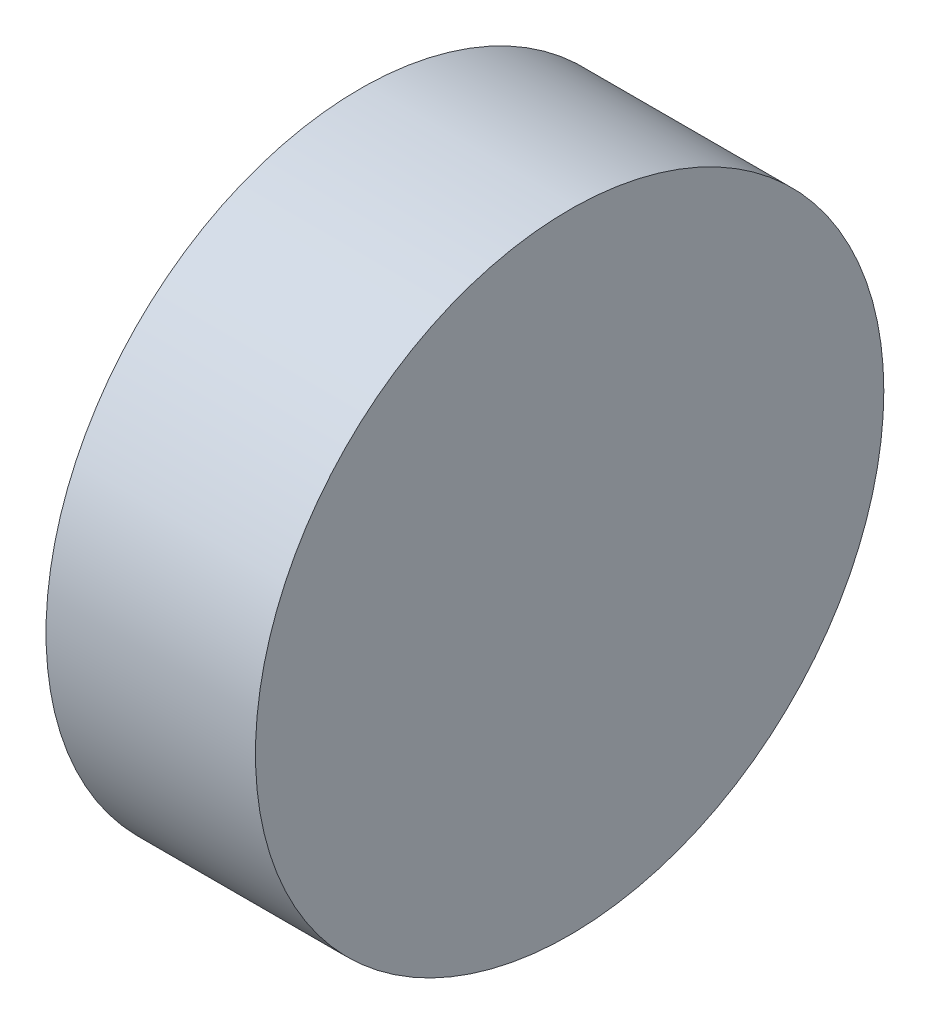
ISO-10303-21;
HEADER;
FILE_DESCRIPTION(('STEP AP214'),'2;1');
FILE_NAME('part.step','',(''),(''),'','','');
FILE_SCHEMA(('AUTOMOTIVE_DESIGN { 1 0 10303 214 1 1 1 1 }'));
ENDSEC;
DATA;
#1=APPLICATION_CONTEXT('core data for automotive mechanical design processes');
#2=APPLICATION_PROTOCOL_DEFINITION('international standard','automotive_design',2000,#1);
#3=PRODUCT_CONTEXT('',#1,'mechanical');
#4=PRODUCT('Part','Part','',(#3));
#5=PRODUCT_RELATED_PRODUCT_CATEGORY('part','',(#4));
#6=PRODUCT_DEFINITION_FORMATION('','',#4);
#7=PRODUCT_DEFINITION_CONTEXT('part definition',#1,'design');
#8=PRODUCT_DEFINITION('design','',#6,#7);
#9=PRODUCT_DEFINITION_SHAPE('','',#8);
#10=(LENGTH_UNIT() NAMED_UNIT(*) SI_UNIT(.MILLI.,.METRE.));
#11=(NAMED_UNIT(*) PLANE_ANGLE_UNIT() SI_UNIT($,.RADIAN.));
#12=(NAMED_UNIT(*) SI_UNIT($,.STERADIAN.) SOLID_ANGLE_UNIT());
#13=UNCERTAINTY_MEASURE_WITH_UNIT(LENGTH_MEASURE(1.E-05),#10,'distance_accuracy_value','');
#14=(GEOMETRIC_REPRESENTATION_CONTEXT(3) GLOBAL_UNCERTAINTY_ASSIGNED_CONTEXT((#13)) GLOBAL_UNIT_ASSIGNED_CONTEXT((#10,
#11,#12)) REPRESENTATION_CONTEXT('',''));
#15=CARTESIAN_POINT('',(0.,0.,0.));
#16=DIRECTION('',(0.,0.,1.));
#17=DIRECTION('',(1.,0.,0.));
#18=AXIS2_PLACEMENT_3D('',#15,#16,#17);
#19=CARTESIAN_POINT('',(-1.,0.,0.));
#20=DIRECTION('',(1.,0.,0.));
#21=DIRECTION('',(0.,0.,-1.));
#22=AXIS2_PLACEMENT_3D('',#19,#20,#21);
#23=CYLINDRICAL_SURFACE('',#22,3.);
#24=CARTESIAN_POINT('',(-1.,0.,0.));
#25=DIRECTION('',(1.,0.,0.));
#26=DIRECTION('',(0.,0.,-1.));
#27=AXIS2_PLACEMENT_3D('',#24,#25,#26);
#28=CIRCLE('',#27,3.);
#29=CARTESIAN_POINT('',(-1.,0.,-3.));
#30=VERTEX_POINT('',#29);
#31=EDGE_CURVE('E10',#30,#30,#28,.T.);
#32=ORIENTED_EDGE('',*,*,#31,.T.);
#33=EDGE_LOOP('',(#32));
#34=FACE_BOUND('',#33,.T.);
#35=CARTESIAN_POINT('',(1.,0.,0.));
#36=DIRECTION('',(1.,0.,0.));
#37=DIRECTION('',(0.,0.,-1.));
#38=AXIS2_PLACEMENT_3D('',#35,#36,#37);
#39=CIRCLE('',#38,3.);
#40=CARTESIAN_POINT('',(1.,0.,-3.));
#41=VERTEX_POINT('',#40);
#42=EDGE_CURVE('E38',#41,#41,#39,.T.);
#43=ORIENTED_EDGE('',*,*,#42,.F.);
#44=EDGE_LOOP('',(#43));
#45=FACE_BOUND('',#44,.T.);
#46=ADVANCED_FACE('F32',(#34,#45),#23,.T.);
#47=CARTESIAN_POINT('',(-1.,0.,0.));
#48=DIRECTION('',(1.,0.,0.));
#49=DIRECTION('',(0.,0.,-1.));
#50=AXIS2_PLACEMENT_3D('',#47,#48,#49);
#51=PLANE('',#50);
#52=ORIENTED_EDGE('',*,*,#31,.F.);
#53=EDGE_LOOP('',(#52));
#54=FACE_BOUND('',#53,.T.);
#55=ADVANCED_FACE('F47',(#54),#51,.F.);
#56=CARTESIAN_POINT('',(1.,0.,0.));
#57=DIRECTION('',(1.,0.,0.));
#58=DIRECTION('',(0.,0.,-1.));
#59=AXIS2_PLACEMENT_3D('',#56,#57,#58);
#60=PLANE('',#59);
#61=ORIENTED_EDGE('',*,*,#42,.T.);
#62=EDGE_LOOP('',(#61));
#63=FACE_BOUND('',#62,.T.);
#64=ADVANCED_FACE('F44',(#63),#60,.T.);
#65=CLOSED_SHELL('',(#46,#55,#64));
#66=MANIFOLD_SOLID_BREP('B2',#65);
#67=ADVANCED_BREP_SHAPE_REPRESENTATION('',(#18,#66),#14);
#68=SHAPE_DEFINITION_REPRESENTATION(#9,#67);
ENDSEC;
END-ISO-10303-21;
